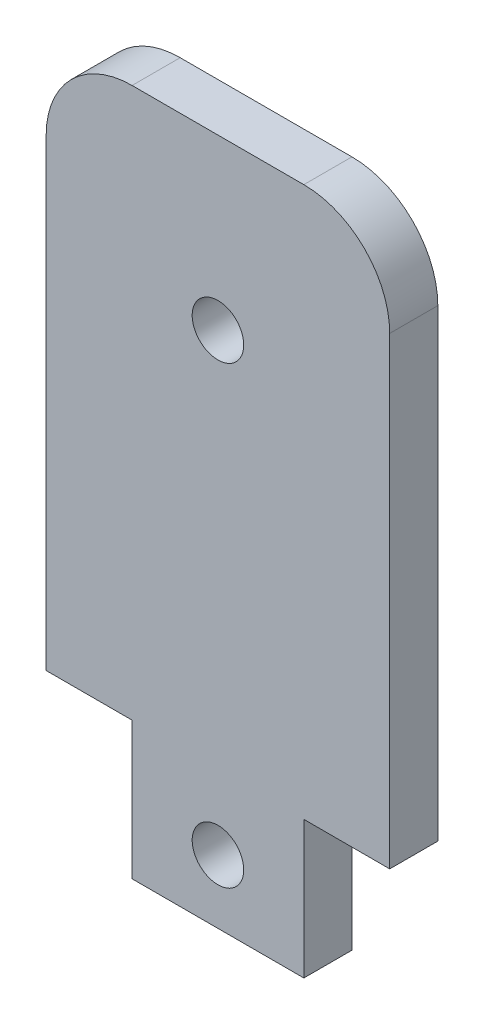
ISO-10303-21;
HEADER;
FILE_DESCRIPTION(('STEP AP214'),'2;1');
FILE_NAME('part.step','',(''),(''),'','','');
FILE_SCHEMA(('AUTOMOTIVE_DESIGN { 1 0 10303 214 1 1 1 1 }'));
ENDSEC;
DATA;
#1=APPLICATION_CONTEXT('core data for automotive mechanical design processes');
#2=APPLICATION_PROTOCOL_DEFINITION('international standard','automotive_design',2000,#1);
#3=PRODUCT_CONTEXT('',#1,'mechanical');
#4=PRODUCT('Part','Part','',(#3));
#5=PRODUCT_RELATED_PRODUCT_CATEGORY('part','',(#4));
#6=PRODUCT_DEFINITION_FORMATION('','',#4);
#7=PRODUCT_DEFINITION_CONTEXT('part definition',#1,'design');
#8=PRODUCT_DEFINITION('design','',#6,#7);
#9=PRODUCT_DEFINITION_SHAPE('','',#8);
#10=(LENGTH_UNIT() NAMED_UNIT(*) SI_UNIT(.MILLI.,.METRE.));
#11=(NAMED_UNIT(*) PLANE_ANGLE_UNIT() SI_UNIT($,.RADIAN.));
#12=(NAMED_UNIT(*) SI_UNIT($,.STERADIAN.) SOLID_ANGLE_UNIT());
#13=UNCERTAINTY_MEASURE_WITH_UNIT(LENGTH_MEASURE(1.E-05),#10,'distance_accuracy_value','');
#14=(GEOMETRIC_REPRESENTATION_CONTEXT(3) GLOBAL_UNCERTAINTY_ASSIGNED_CONTEXT((#13)) GLOBAL_UNIT_ASSIGNED_CONTEXT((#10,
#11,#12)) REPRESENTATION_CONTEXT('',''));
#15=CARTESIAN_POINT('',(0.,0.,0.));
#16=DIRECTION('',(0.,0.,1.));
#17=DIRECTION('',(1.,0.,0.));
#18=AXIS2_PLACEMENT_3D('',#15,#16,#17);
#19=CARTESIAN_POINT('',(294.016315947266,146.094134865685,2.8));
#20=DIRECTION('',(0.,0.,1.));
#21=DIRECTION('',(1.,0.,0.));
#22=AXIS2_PLACEMENT_3D('',#19,#20,#21);
#23=PLANE('',#22);
#24=CARTESIAN_POINT('',(299.016315947266,114.794134865685,2.8));
#25=DIRECTION('',(0.,0.,1.));
#26=DIRECTION('',(1.,0.,0.));
#27=AXIS2_PLACEMENT_3D('',#24,#25,#26);
#28=CIRCLE('',#27,1.5);
#29=CARTESIAN_POINT('',(300.516315947266,114.794134865685,2.8));
#30=VERTEX_POINT('',#29);
#31=EDGE_CURVE('E149',#30,#30,#28,.T.);
#32=ORIENTED_EDGE('',*,*,#31,.F.);
#33=EDGE_LOOP('',(#32));
#34=FACE_BOUND('',#33,.T.);
#35=CARTESIAN_POINT('',(294.016315947266,146.094134865685,2.8));
#36=DIRECTION('',(0.,0.,1.));
#37=DIRECTION('',(1.,0.,0.));
#38=AXIS2_PLACEMENT_3D('',#35,#36,#37);
#39=CIRCLE('',#38,4.99999999999996);
#40=CARTESIAN_POINT('',(294.016315947266,151.094134865685,2.8));
#41=VERTEX_POINT('',#40);
#42=CARTESIAN_POINT('',(289.016315947266,146.094134865685,2.8));
#43=VERTEX_POINT('',#42);
#44=EDGE_CURVE('E165',#41,#43,#39,.T.);
#45=ORIENTED_EDGE('',*,*,#44,.T.);
#46=DIRECTION('',(0.,-1.,0.));
#47=VECTOR('',#46,1.);
#48=CARTESIAN_POINT('',(289.016315947266,119.094134865685,2.8));
#49=LINE('',#48,#47);
#50=CARTESIAN_POINT('',(289.016315947266,119.094134865685,2.8));
#51=VERTEX_POINT('',#50);
#52=EDGE_CURVE('E102',#43,#51,#49,.T.);
#53=ORIENTED_EDGE('',*,*,#52,.T.);
#54=DIRECTION('',(1.,0.,0.));
#55=VECTOR('',#54,1.);
#56=CARTESIAN_POINT('',(294.016315947266,119.094134865685,2.8));
#57=LINE('',#56,#55);
#58=CARTESIAN_POINT('',(294.016315947266,119.094134865685,2.8));
#59=VERTEX_POINT('',#58);
#60=EDGE_CURVE('E186',#51,#59,#57,.T.);
#61=ORIENTED_EDGE('',*,*,#60,.T.);
#62=DIRECTION('',(0.,-1.,0.));
#63=VECTOR('',#62,1.);
#64=CARTESIAN_POINT('',(294.016315947266,111.094134865685,2.8));
#65=LINE('',#64,#63);
#66=CARTESIAN_POINT('',(294.016315947266,111.094134865685,2.8));
#67=VERTEX_POINT('',#66);
#68=EDGE_CURVE('E204',#59,#67,#65,.T.);
#69=ORIENTED_EDGE('',*,*,#68,.T.);
#70=DIRECTION('',(1.,0.,0.));
#71=VECTOR('',#70,1.);
#72=CARTESIAN_POINT('',(299.016315947266,111.094134865685,2.8));
#73=LINE('',#72,#71);
#74=CARTESIAN_POINT('',(304.016315947266,111.094134865685,2.8));
#75=VERTEX_POINT('',#74);
#76=EDGE_CURVE('E201',#67,#75,#73,.T.);
#77=ORIENTED_EDGE('',*,*,#76,.T.);
#78=DIRECTION('',(0.,1.,0.));
#79=VECTOR('',#78,1.);
#80=CARTESIAN_POINT('',(304.016315947266,111.094134865685,2.8));
#81=LINE('',#80,#79);
#82=CARTESIAN_POINT('',(304.016315947266,119.094134865685,2.8));
#83=VERTEX_POINT('',#82);
#84=EDGE_CURVE('E203',#75,#83,#81,.T.);
#85=ORIENTED_EDGE('',*,*,#84,.T.);
#86=DIRECTION('',(1.,0.,0.));
#87=VECTOR('',#86,1.);
#88=CARTESIAN_POINT('',(304.016315947266,119.094134865685,2.8));
#89=LINE('',#88,#87);
#90=CARTESIAN_POINT('',(309.016315947266,119.094134865685,2.8));
#91=VERTEX_POINT('',#90);
#92=EDGE_CURVE('E127',#83,#91,#89,.T.);
#93=ORIENTED_EDGE('',*,*,#92,.T.);
#94=DIRECTION('',(0.,1.,0.));
#95=VECTOR('',#94,1.);
#96=CARTESIAN_POINT('',(309.016315947266,146.094134865685,2.8));
#97=LINE('',#96,#95);
#98=CARTESIAN_POINT('',(309.016315947266,146.094134865685,2.8));
#99=VERTEX_POINT('',#98);
#100=EDGE_CURVE('E121',#91,#99,#97,.T.);
#101=ORIENTED_EDGE('',*,*,#100,.T.);
#102=CARTESIAN_POINT('',(304.016315947266,146.094134865685,2.8));
#103=DIRECTION('',(0.,0.,1.));
#104=DIRECTION('',(1.,0.,0.));
#105=AXIS2_PLACEMENT_3D('',#102,#103,#104);
#106=CIRCLE('',#105,4.99999999999999);
#107=CARTESIAN_POINT('',(304.016315947266,151.094134865685,2.8));
#108=VERTEX_POINT('',#107);
#109=EDGE_CURVE('E125',#99,#108,#106,.T.);
#110=ORIENTED_EDGE('',*,*,#109,.T.);
#111=DIRECTION('',(-1.,0.,0.));
#112=VECTOR('',#111,1.);
#113=CARTESIAN_POINT('',(294.016315947266,151.094134865685,2.8));
#114=LINE('',#113,#112);
#115=EDGE_CURVE('E53',#108,#41,#114,.T.);
#116=ORIENTED_EDGE('',*,*,#115,.T.);
#117=EDGE_LOOP('',(#45,#53,#61,#69,#77,#85,#93,#101,#110,#116));
#118=FACE_BOUND('',#117,.T.);
#119=CARTESIAN_POINT('',(299.016315947266,141.254134865685,2.8));
#120=DIRECTION('',(0.,0.,1.));
#121=DIRECTION('',(1.,0.,0.));
#122=AXIS2_PLACEMENT_3D('',#119,#120,#121);
#123=CIRCLE('',#122,1.5);
#124=CARTESIAN_POINT('',(300.516315947266,141.254134865685,2.8));
#125=VERTEX_POINT('',#124);
#126=EDGE_CURVE('E215',#125,#125,#123,.T.);
#127=ORIENTED_EDGE('',*,*,#126,.F.);
#128=EDGE_LOOP('',(#127));
#129=FACE_BOUND('',#128,.T.);
#130=ADVANCED_FACE('F36',(#34,#118,#129),#23,.T.);
#131=CARTESIAN_POINT('',(294.016315947266,146.094134865685,0.));
#132=DIRECTION('',(0.,0.,1.));
#133=DIRECTION('',(1.,0.,0.));
#134=AXIS2_PLACEMENT_3D('',#131,#132,#133);
#135=PLANE('',#134);
#136=CARTESIAN_POINT('',(294.016315947266,146.094134865685,0.));
#137=DIRECTION('',(0.,0.,1.));
#138=DIRECTION('',(1.,0.,0.));
#139=AXIS2_PLACEMENT_3D('',#136,#137,#138);
#140=CIRCLE('',#139,4.99999999999996);
#141=CARTESIAN_POINT('',(294.016315947266,151.094134865685,0.));
#142=VERTEX_POINT('',#141);
#143=CARTESIAN_POINT('',(289.016315947266,146.094134865685,0.));
#144=VERTEX_POINT('',#143);
#145=EDGE_CURVE('E145',#142,#144,#140,.T.);
#146=ORIENTED_EDGE('',*,*,#145,.F.);
#147=DIRECTION('',(-1.,0.,0.));
#148=VECTOR('',#147,1.);
#149=CARTESIAN_POINT('',(294.016315947266,151.094134865685,0.));
#150=LINE('',#149,#148);
#151=CARTESIAN_POINT('',(304.016315947266,151.094134865685,0.));
#152=VERTEX_POINT('',#151);
#153=EDGE_CURVE('E94',#152,#142,#150,.T.);
#154=ORIENTED_EDGE('',*,*,#153,.F.);
#155=CARTESIAN_POINT('',(304.016315947266,146.094134865685,0.));
#156=DIRECTION('',(0.,0.,1.));
#157=DIRECTION('',(1.,0.,0.));
#158=AXIS2_PLACEMENT_3D('',#155,#156,#157);
#159=CIRCLE('',#158,4.99999999999999);
#160=CARTESIAN_POINT('',(309.016315947266,146.094134865685,0.));
#161=VERTEX_POINT('',#160);
#162=EDGE_CURVE('E88',#161,#152,#159,.T.);
#163=ORIENTED_EDGE('',*,*,#162,.F.);
#164=DIRECTION('',(0.,1.,0.));
#165=VECTOR('',#164,1.);
#166=CARTESIAN_POINT('',(309.016315947266,146.094134865685,0.));
#167=LINE('',#166,#165);
#168=CARTESIAN_POINT('',(309.016315947266,119.094134865685,0.));
#169=VERTEX_POINT('',#168);
#170=EDGE_CURVE('E135',#169,#161,#167,.T.);
#171=ORIENTED_EDGE('',*,*,#170,.F.);
#172=DIRECTION('',(1.,0.,0.));
#173=VECTOR('',#172,1.);
#174=CARTESIAN_POINT('',(304.016315947266,119.094134865685,0.));
#175=LINE('',#174,#173);
#176=CARTESIAN_POINT('',(304.016315947266,119.094134865685,0.));
#177=VERTEX_POINT('',#176);
#178=EDGE_CURVE('E160',#177,#169,#175,.T.);
#179=ORIENTED_EDGE('',*,*,#178,.F.);
#180=DIRECTION('',(0.,1.,0.));
#181=VECTOR('',#180,1.);
#182=CARTESIAN_POINT('',(304.016315947266,111.094134865685,0.));
#183=LINE('',#182,#181);
#184=CARTESIAN_POINT('',(304.016315947266,111.094134865685,0.));
#185=VERTEX_POINT('',#184);
#186=EDGE_CURVE('E158',#185,#177,#183,.T.);
#187=ORIENTED_EDGE('',*,*,#186,.F.);
#188=DIRECTION('',(1.,0.,0.));
#189=VECTOR('',#188,1.);
#190=CARTESIAN_POINT('',(299.016315947266,111.094134865685,0.));
#191=LINE('',#190,#189);
#192=CARTESIAN_POINT('',(294.016315947266,111.094134865685,0.));
#193=VERTEX_POINT('',#192);
#194=EDGE_CURVE('E156',#193,#185,#191,.T.);
#195=ORIENTED_EDGE('',*,*,#194,.F.);
#196=DIRECTION('',(0.,-1.,0.));
#197=VECTOR('',#196,1.);
#198=CARTESIAN_POINT('',(294.016315947266,111.094134865685,0.));
#199=LINE('',#198,#197);
#200=CARTESIAN_POINT('',(294.016315947266,119.094134865685,0.));
#201=VERTEX_POINT('',#200);
#202=EDGE_CURVE('E153',#201,#193,#199,.T.);
#203=ORIENTED_EDGE('',*,*,#202,.F.);
#204=DIRECTION('',(1.,0.,0.));
#205=VECTOR('',#204,1.);
#206=CARTESIAN_POINT('',(294.016315947266,119.094134865685,0.));
#207=LINE('',#206,#205);
#208=CARTESIAN_POINT('',(289.016315947266,119.094134865685,0.));
#209=VERTEX_POINT('',#208);
#210=EDGE_CURVE('E151',#209,#201,#207,.T.);
#211=ORIENTED_EDGE('',*,*,#210,.F.);
#212=DIRECTION('',(0.,-1.,0.));
#213=VECTOR('',#212,1.);
#214=CARTESIAN_POINT('',(289.016315947266,119.094134865685,0.));
#215=LINE('',#214,#213);
#216=EDGE_CURVE('E148',#144,#209,#215,.T.);
#217=ORIENTED_EDGE('',*,*,#216,.F.);
#218=EDGE_LOOP('',(#146,#154,#163,#171,#179,#187,#195,#203,#211,#217));
#219=FACE_BOUND('',#218,.T.);
#220=CARTESIAN_POINT('',(299.016315947266,114.794134865685,0.));
#221=DIRECTION('',(0.,0.,1.));
#222=DIRECTION('',(1.,0.,0.));
#223=AXIS2_PLACEMENT_3D('',#220,#221,#222);
#224=CIRCLE('',#223,1.5);
#225=CARTESIAN_POINT('',(300.516315947266,114.794134865685,0.));
#226=VERTEX_POINT('',#225);
#227=EDGE_CURVE('E212',#226,#226,#224,.T.);
#228=ORIENTED_EDGE('',*,*,#227,.T.);
#229=EDGE_LOOP('',(#228));
#230=FACE_BOUND('',#229,.T.);
#231=CARTESIAN_POINT('',(299.016315947266,141.254134865685,0.));
#232=DIRECTION('',(0.,0.,1.));
#233=DIRECTION('',(1.,0.,0.));
#234=AXIS2_PLACEMENT_3D('',#231,#232,#233);
#235=CIRCLE('',#234,1.5);
#236=CARTESIAN_POINT('',(300.516315947266,141.254134865685,0.));
#237=VERTEX_POINT('',#236);
#238=EDGE_CURVE('E218',#237,#237,#235,.T.);
#239=ORIENTED_EDGE('',*,*,#238,.T.);
#240=EDGE_LOOP('',(#239));
#241=FACE_BOUND('',#240,.T.);
#242=ADVANCED_FACE('F190',(#219,#230,#241),#135,.F.);
#243=CARTESIAN_POINT('',(294.016315947266,146.094134865685,2.8));
#244=DIRECTION('',(0.,0.,-1.));
#245=DIRECTION('',(-1.,0.,0.));
#246=AXIS2_PLACEMENT_3D('',#243,#244,#245);
#247=CYLINDRICAL_SURFACE('',#246,4.99999999999996);
#248=ORIENTED_EDGE('',*,*,#145,.T.);
#249=DIRECTION('',(0.,0.,-1.));
#250=VECTOR('',#249,1.);
#251=CARTESIAN_POINT('',(289.016315947266,146.094134865685,2.8));
#252=LINE('',#251,#250);
#253=EDGE_CURVE('E11',#43,#144,#252,.T.);
#254=ORIENTED_EDGE('',*,*,#253,.F.);
#255=ORIENTED_EDGE('',*,*,#44,.F.);
#256=DIRECTION('',(0.,0.,-1.));
#257=VECTOR('',#256,1.);
#258=CARTESIAN_POINT('',(294.016315947266,151.094134865685,2.8));
#259=LINE('',#258,#257);
#260=EDGE_CURVE('E141',#41,#142,#259,.T.);
#261=ORIENTED_EDGE('',*,*,#260,.T.);
#262=EDGE_LOOP('',(#248,#254,#255,#261));
#263=FACE_BOUND('',#262,.T.);
#264=ADVANCED_FACE('F38',(#263),#247,.T.);
#265=CARTESIAN_POINT('',(289.016315947266,119.094134865685,2.8));
#266=DIRECTION('',(1.,0.,0.));
#267=DIRECTION('',(0.,0.,-1.));
#268=AXIS2_PLACEMENT_3D('',#265,#266,#267);
#269=PLANE('',#268);
#270=ORIENTED_EDGE('',*,*,#216,.T.);
#271=DIRECTION('',(0.,0.,-1.));
#272=VECTOR('',#271,1.);
#273=CARTESIAN_POINT('',(289.016315947266,119.094134865685,2.8));
#274=LINE('',#273,#272);
#275=EDGE_CURVE('E45',#51,#209,#274,.T.);
#276=ORIENTED_EDGE('',*,*,#275,.F.);
#277=ORIENTED_EDGE('',*,*,#52,.F.);
#278=ORIENTED_EDGE('',*,*,#253,.T.);
#279=EDGE_LOOP('',(#270,#276,#277,#278));
#280=FACE_BOUND('',#279,.T.);
#281=ADVANCED_FACE('F258',(#280),#269,.F.);
#282=CARTESIAN_POINT('',(294.016315947266,119.094134865685,2.8));
#283=DIRECTION('',(0.,1.,0.));
#284=DIRECTION('',(0.,0.,1.));
#285=AXIS2_PLACEMENT_3D('',#282,#283,#284);
#286=PLANE('',#285);
#287=ORIENTED_EDGE('',*,*,#210,.T.);
#288=DIRECTION('',(0.,0.,-1.));
#289=VECTOR('',#288,1.);
#290=CARTESIAN_POINT('',(294.016315947266,119.094134865685,2.8));
#291=LINE('',#290,#289);
#292=EDGE_CURVE('E178',#59,#201,#291,.T.);
#293=ORIENTED_EDGE('',*,*,#292,.F.);
#294=ORIENTED_EDGE('',*,*,#60,.F.);
#295=ORIENTED_EDGE('',*,*,#275,.T.);
#296=EDGE_LOOP('',(#287,#293,#294,#295));
#297=FACE_BOUND('',#296,.T.);
#298=ADVANCED_FACE('F184',(#297),#286,.F.);
#299=CARTESIAN_POINT('',(294.016315947266,111.094134865685,2.8));
#300=DIRECTION('',(1.,0.,0.));
#301=DIRECTION('',(0.,0.,-1.));
#302=AXIS2_PLACEMENT_3D('',#299,#300,#301);
#303=PLANE('',#302);
#304=ORIENTED_EDGE('',*,*,#202,.T.);
#305=DIRECTION('',(0.,0.,-1.));
#306=VECTOR('',#305,1.);
#307=CARTESIAN_POINT('',(294.016315947266,111.094134865685,2.8));
#308=LINE('',#307,#306);
#309=EDGE_CURVE('E175',#67,#193,#308,.T.);
#310=ORIENTED_EDGE('',*,*,#309,.F.);
#311=ORIENTED_EDGE('',*,*,#68,.F.);
#312=ORIENTED_EDGE('',*,*,#292,.T.);
#313=EDGE_LOOP('',(#304,#310,#311,#312));
#314=FACE_BOUND('',#313,.T.);
#315=ADVANCED_FACE('F195',(#314),#303,.F.);
#316=CARTESIAN_POINT('',(299.016315947266,111.094134865685,2.8));
#317=DIRECTION('',(0.,1.,0.));
#318=DIRECTION('',(0.,0.,1.));
#319=AXIS2_PLACEMENT_3D('',#316,#317,#318);
#320=PLANE('',#319);
#321=ORIENTED_EDGE('',*,*,#194,.T.);
#322=DIRECTION('',(0.,0.,-1.));
#323=VECTOR('',#322,1.);
#324=CARTESIAN_POINT('',(304.016315947266,111.094134865685,2.8));
#325=LINE('',#324,#323);
#326=EDGE_CURVE('E172',#75,#185,#325,.T.);
#327=ORIENTED_EDGE('',*,*,#326,.F.);
#328=ORIENTED_EDGE('',*,*,#76,.F.);
#329=ORIENTED_EDGE('',*,*,#309,.T.);
#330=EDGE_LOOP('',(#321,#327,#328,#329));
#331=FACE_BOUND('',#330,.T.);
#332=ADVANCED_FACE('F199',(#331),#320,.F.);
#333=CARTESIAN_POINT('',(304.016315947266,111.094134865685,2.8));
#334=DIRECTION('',(-1.,0.,0.));
#335=DIRECTION('',(0.,0.,1.));
#336=AXIS2_PLACEMENT_3D('',#333,#334,#335);
#337=PLANE('',#336);
#338=ORIENTED_EDGE('',*,*,#186,.T.);
#339=DIRECTION('',(0.,0.,-1.));
#340=VECTOR('',#339,1.);
#341=CARTESIAN_POINT('',(304.016315947266,119.094134865685,2.8));
#342=LINE('',#341,#340);
#343=EDGE_CURVE('E169',#83,#177,#342,.T.);
#344=ORIENTED_EDGE('',*,*,#343,.F.);
#345=ORIENTED_EDGE('',*,*,#84,.F.);
#346=ORIENTED_EDGE('',*,*,#326,.T.);
#347=EDGE_LOOP('',(#338,#344,#345,#346));
#348=FACE_BOUND('',#347,.T.);
#349=ADVANCED_FACE('F248',(#348),#337,.F.);
#350=CARTESIAN_POINT('',(304.016315947266,119.094134865685,2.8));
#351=DIRECTION('',(0.,1.,0.));
#352=DIRECTION('',(0.,0.,1.));
#353=AXIS2_PLACEMENT_3D('',#350,#351,#352);
#354=PLANE('',#353);
#355=ORIENTED_EDGE('',*,*,#178,.T.);
#356=DIRECTION('',(0.,0.,-1.));
#357=VECTOR('',#356,1.);
#358=CARTESIAN_POINT('',(309.016315947266,119.094134865685,2.8));
#359=LINE('',#358,#357);
#360=EDGE_CURVE('E136',#91,#169,#359,.T.);
#361=ORIENTED_EDGE('',*,*,#360,.F.);
#362=ORIENTED_EDGE('',*,*,#92,.F.);
#363=ORIENTED_EDGE('',*,*,#343,.T.);
#364=EDGE_LOOP('',(#355,#361,#362,#363));
#365=FACE_BOUND('',#364,.T.);
#366=ADVANCED_FACE('F245',(#365),#354,.F.);
#367=CARTESIAN_POINT('',(309.016315947266,146.094134865685,2.8));
#368=DIRECTION('',(-1.,0.,0.));
#369=DIRECTION('',(0.,0.,1.));
#370=AXIS2_PLACEMENT_3D('',#367,#368,#369);
#371=PLANE('',#370);
#372=ORIENTED_EDGE('',*,*,#170,.T.);
#373=DIRECTION('',(0.,0.,-1.));
#374=VECTOR('',#373,1.);
#375=CARTESIAN_POINT('',(309.016315947266,146.094134865685,2.8));
#376=LINE('',#375,#374);
#377=EDGE_CURVE('E132',#99,#161,#376,.T.);
#378=ORIENTED_EDGE('',*,*,#377,.F.);
#379=ORIENTED_EDGE('',*,*,#100,.F.);
#380=ORIENTED_EDGE('',*,*,#360,.T.);
#381=EDGE_LOOP('',(#372,#378,#379,#380));
#382=FACE_BOUND('',#381,.T.);
#383=ADVANCED_FACE('F133',(#382),#371,.F.);
#384=CARTESIAN_POINT('',(304.016315947266,146.094134865685,2.8));
#385=DIRECTION('',(0.,0.,-1.));
#386=DIRECTION('',(-1.,0.,0.));
#387=AXIS2_PLACEMENT_3D('',#384,#385,#386);
#388=CYLINDRICAL_SURFACE('',#387,4.99999999999999);
#389=ORIENTED_EDGE('',*,*,#162,.T.);
#390=DIRECTION('',(0.,0.,-1.));
#391=VECTOR('',#390,1.);
#392=CARTESIAN_POINT('',(304.016315947266,151.094134865685,2.8));
#393=LINE('',#392,#391);
#394=EDGE_CURVE('E137',#108,#152,#393,.T.);
#395=ORIENTED_EDGE('',*,*,#394,.F.);
#396=ORIENTED_EDGE('',*,*,#109,.F.);
#397=ORIENTED_EDGE('',*,*,#377,.T.);
#398=EDGE_LOOP('',(#389,#395,#396,#397));
#399=FACE_BOUND('',#398,.T.);
#400=ADVANCED_FACE('F139',(#399),#388,.T.);
#401=CARTESIAN_POINT('',(294.016315947266,151.094134865685,2.8));
#402=DIRECTION('',(0.,-1.,0.));
#403=DIRECTION('',(0.,0.,-1.));
#404=AXIS2_PLACEMENT_3D('',#401,#402,#403);
#405=PLANE('',#404);
#406=ORIENTED_EDGE('',*,*,#153,.T.);
#407=ORIENTED_EDGE('',*,*,#260,.F.);
#408=ORIENTED_EDGE('',*,*,#115,.F.);
#409=ORIENTED_EDGE('',*,*,#394,.T.);
#410=EDGE_LOOP('',(#406,#407,#408,#409));
#411=FACE_BOUND('',#410,.T.);
#412=ADVANCED_FACE('F238',(#411),#405,.F.);
#413=CARTESIAN_POINT('',(299.016315947266,114.794134865685,2.8));
#414=DIRECTION('',(0.,0.,-1.));
#415=DIRECTION('',(-1.,0.,0.));
#416=AXIS2_PLACEMENT_3D('',#413,#414,#415);
#417=CYLINDRICAL_SURFACE('',#416,1.5);
#418=ORIENTED_EDGE('',*,*,#31,.T.);
#419=EDGE_LOOP('',(#418));
#420=FACE_BOUND('',#419,.T.);
#421=ORIENTED_EDGE('',*,*,#227,.F.);
#422=EDGE_LOOP('',(#421));
#423=FACE_BOUND('',#422,.T.);
#424=ADVANCED_FACE('F235',(#420,#423),#417,.F.);
#425=CARTESIAN_POINT('',(299.016315947266,141.254134865685,2.8));
#426=DIRECTION('',(0.,0.,-1.));
#427=DIRECTION('',(-1.,0.,0.));
#428=AXIS2_PLACEMENT_3D('',#425,#426,#427);
#429=CYLINDRICAL_SURFACE('',#428,1.5);
#430=ORIENTED_EDGE('',*,*,#126,.T.);
#431=EDGE_LOOP('',(#430));
#432=FACE_BOUND('',#431,.T.);
#433=ORIENTED_EDGE('',*,*,#238,.F.);
#434=EDGE_LOOP('',(#433));
#435=FACE_BOUND('',#434,.T.);
#436=ADVANCED_FACE('F224',(#432,#435),#429,.F.);
#437=CLOSED_SHELL('',(#130,#242,#264,#281,#298,#315,#332,#349,#366,#383,#400,#412,#424,#436));
#438=MANIFOLD_SOLID_BREP('B2',#437);
#439=ADVANCED_BREP_SHAPE_REPRESENTATION('',(#18,#438),#14);
#440=SHAPE_DEFINITION_REPRESENTATION(#9,#439);
ENDSEC;
END-ISO-10303-21;
